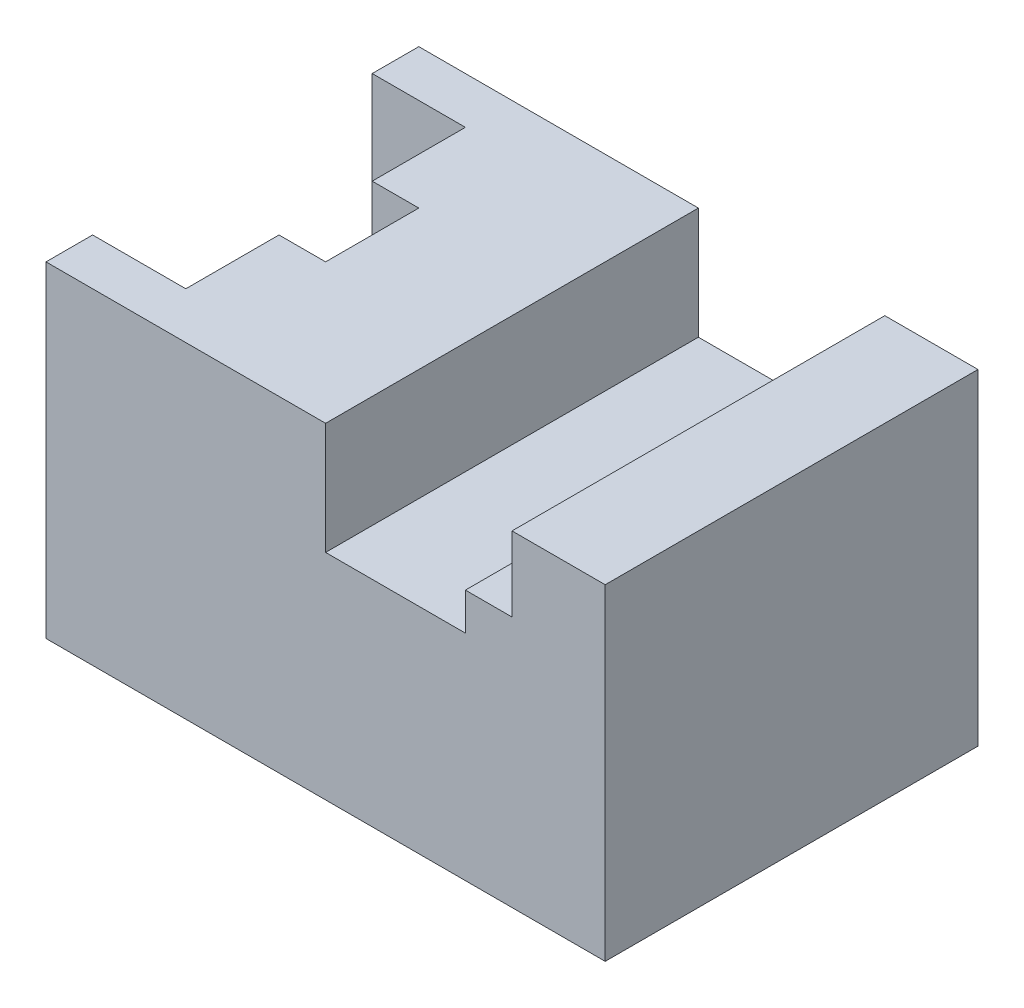
ISO-10303-21;
HEADER;
FILE_DESCRIPTION(('STEP AP214'),'2;1');
FILE_NAME('part.step','',(''),(''),'','','');
FILE_SCHEMA(('AUTOMOTIVE_DESIGN { 1 0 10303 214 1 1 1 1 }'));
ENDSEC;
DATA;
#1=APPLICATION_CONTEXT('core data for automotive mechanical design processes');
#2=APPLICATION_PROTOCOL_DEFINITION('international standard','automotive_design',2000,#1);
#3=PRODUCT_CONTEXT('',#1,'mechanical');
#4=PRODUCT('Part','Part','',(#3));
#5=PRODUCT_RELATED_PRODUCT_CATEGORY('part','',(#4));
#6=PRODUCT_DEFINITION_FORMATION('','',#4);
#7=PRODUCT_DEFINITION_CONTEXT('part definition',#1,'design');
#8=PRODUCT_DEFINITION('design','',#6,#7);
#9=PRODUCT_DEFINITION_SHAPE('','',#8);
#10=(LENGTH_UNIT() NAMED_UNIT(*) SI_UNIT(.MILLI.,.METRE.));
#11=(NAMED_UNIT(*) PLANE_ANGLE_UNIT() SI_UNIT($,.RADIAN.));
#12=(NAMED_UNIT(*) SI_UNIT($,.STERADIAN.) SOLID_ANGLE_UNIT());
#13=UNCERTAINTY_MEASURE_WITH_UNIT(LENGTH_MEASURE(1.E-05),#10,'distance_accuracy_value','');
#14=(GEOMETRIC_REPRESENTATION_CONTEXT(3) GLOBAL_UNCERTAINTY_ASSIGNED_CONTEXT((#13)) GLOBAL_UNIT_ASSIGNED_CONTEXT((#10,
#11,#12)) REPRESENTATION_CONTEXT('',''));
#15=CARTESIAN_POINT('',(0.,0.,0.));
#16=DIRECTION('',(0.,0.,1.));
#17=DIRECTION('',(1.,0.,0.));
#18=AXIS2_PLACEMENT_3D('',#15,#16,#17);
#19=CARTESIAN_POINT('',(-30.,17.5,20.));
#20=DIRECTION('',(0.,-1.,0.));
#21=DIRECTION('',(0.,0.,-1.));
#22=AXIS2_PLACEMENT_3D('',#19,#20,#21);
#23=PLANE('',#22);
#24=DIRECTION('',(0.,0.,1.));
#25=VECTOR('',#24,1.);
#26=CARTESIAN_POINT('',(0.,17.5,-20.));
#27=LINE('',#26,#25);
#28=CARTESIAN_POINT('',(0.,17.5,-20.));
#29=VERTEX_POINT('',#28);
#30=CARTESIAN_POINT('',(0.,17.5,20.));
#31=VERTEX_POINT('',#30);
#32=EDGE_CURVE('E203',#29,#31,#27,.T.);
#33=ORIENTED_EDGE('',*,*,#32,.F.);
#34=DIRECTION('',(-1.,0.,0.));
#35=VECTOR('',#34,1.);
#36=CARTESIAN_POINT('',(-30.,17.5,-20.));
#37=LINE('',#36,#35);
#38=CARTESIAN_POINT('',(-30.,17.5,-20.));
#39=VERTEX_POINT('',#38);
#40=EDGE_CURVE('E278',#29,#39,#37,.T.);
#41=ORIENTED_EDGE('',*,*,#40,.T.);
#42=DIRECTION('',(0.,0.,-1.));
#43=VECTOR('',#42,1.);
#44=CARTESIAN_POINT('',(-30.,17.5,20.));
#45=LINE('',#44,#43);
#46=CARTESIAN_POINT('',(-30.,17.5,-15.));
#47=VERTEX_POINT('',#46);
#48=EDGE_CURVE('E289',#47,#39,#45,.T.);
#49=ORIENTED_EDGE('',*,*,#48,.F.);
#50=DIRECTION('',(1.,0.,0.));
#51=VECTOR('',#50,1.);
#52=CARTESIAN_POINT('',(0.,17.5,-15.));
#53=LINE('',#52,#51);
#54=CARTESIAN_POINT('',(-20.,17.5,-15.));
#55=VERTEX_POINT('',#54);
#56=EDGE_CURVE('E244',#47,#55,#53,.T.);
#57=ORIENTED_EDGE('',*,*,#56,.T.);
#58=DIRECTION('',(0.,0.,-1.));
#59=VECTOR('',#58,1.);
#60=CARTESIAN_POINT('',(-20.,17.5,0.));
#61=LINE('',#60,#59);
#62=CARTESIAN_POINT('',(-20.,17.5,-5.));
#63=VERTEX_POINT('',#62);
#64=EDGE_CURVE('E235',#63,#55,#61,.T.);
#65=ORIENTED_EDGE('',*,*,#64,.F.);
#66=DIRECTION('',(-1.,0.,0.));
#67=VECTOR('',#66,1.);
#68=CARTESIAN_POINT('',(0.,17.5,-5.));
#69=LINE('',#68,#67);
#70=CARTESIAN_POINT('',(-15.,17.5,-5.));
#71=VERTEX_POINT('',#70);
#72=EDGE_CURVE('E241',#71,#63,#69,.T.);
#73=ORIENTED_EDGE('',*,*,#72,.F.);
#74=DIRECTION('',(0.,0.,-1.));
#75=VECTOR('',#74,1.);
#76=CARTESIAN_POINT('',(-15.,17.5,0.));
#77=LINE('',#76,#75);
#78=CARTESIAN_POINT('',(-15.,17.5,5.));
#79=VERTEX_POINT('',#78);
#80=EDGE_CURVE('E238',#79,#71,#77,.T.);
#81=ORIENTED_EDGE('',*,*,#80,.F.);
#82=DIRECTION('',(-1.,0.,0.));
#83=VECTOR('',#82,1.);
#84=CARTESIAN_POINT('',(0.,17.5,5.));
#85=LINE('',#84,#83);
#86=CARTESIAN_POINT('',(-20.,17.5,5.));
#87=VERTEX_POINT('',#86);
#88=EDGE_CURVE('E234',#79,#87,#85,.T.);
#89=ORIENTED_EDGE('',*,*,#88,.T.);
#90=CARTESIAN_POINT('',(-20.,17.5,15.));
#91=VERTEX_POINT('',#90);
#92=EDGE_CURVE('E231',#91,#87,#61,.T.);
#93=ORIENTED_EDGE('',*,*,#92,.F.);
#94=DIRECTION('',(1.,0.,0.));
#95=VECTOR('',#94,1.);
#96=CARTESIAN_POINT('',(0.,17.5,15.));
#97=LINE('',#96,#95);
#98=CARTESIAN_POINT('',(-30.,17.5,15.));
#99=VERTEX_POINT('',#98);
#100=EDGE_CURVE('E202',#99,#91,#97,.T.);
#101=ORIENTED_EDGE('',*,*,#100,.F.);
#102=CARTESIAN_POINT('',(-30.,17.5,20.));
#103=VERTEX_POINT('',#102);
#104=EDGE_CURVE('E44',#103,#99,#45,.T.);
#105=ORIENTED_EDGE('',*,*,#104,.F.);
#106=DIRECTION('',(-1.,0.,0.));
#107=VECTOR('',#106,1.);
#108=CARTESIAN_POINT('',(-30.,17.5,20.));
#109=LINE('',#108,#107);
#110=EDGE_CURVE('E266',#31,#103,#109,.T.);
#111=ORIENTED_EDGE('',*,*,#110,.F.);
#112=EDGE_LOOP('',(#33,#41,#49,#57,#65,#73,#81,#89,#93,#101,#105,#111));
#113=FACE_BOUND('',#112,.T.);
#114=ADVANCED_FACE('F36',(#113),#23,.F.);
#115=CARTESIAN_POINT('',(0.,0.,20.));
#116=DIRECTION('',(0.,0.,-1.));
#117=DIRECTION('',(-1.,0.,0.));
#118=AXIS2_PLACEMENT_3D('',#115,#116,#117);
#119=PLANE('',#118);
#120=DIRECTION('',(0.,1.,0.));
#121=VECTOR('',#120,1.);
#122=CARTESIAN_POINT('',(0.,0.,20.));
#123=LINE('',#122,#121);
#124=CARTESIAN_POINT('',(0.,5.5,20.));
#125=VERTEX_POINT('',#124);
#126=EDGE_CURVE('E182',#125,#31,#123,.T.);
#127=ORIENTED_EDGE('',*,*,#126,.T.);
#128=ORIENTED_EDGE('',*,*,#110,.T.);
#129=DIRECTION('',(0.,-1.,0.));
#130=VECTOR('',#129,1.);
#131=CARTESIAN_POINT('',(-30.,-17.5,20.));
#132=LINE('',#131,#130);
#133=CARTESIAN_POINT('',(-30.,-17.5,20.));
#134=VERTEX_POINT('',#133);
#135=EDGE_CURVE('E271',#103,#134,#132,.T.);
#136=ORIENTED_EDGE('',*,*,#135,.T.);
#137=DIRECTION('',(1.,0.,0.));
#138=VECTOR('',#137,1.);
#139=CARTESIAN_POINT('',(-30.,-17.5,20.));
#140=LINE('',#139,#138);
#141=CARTESIAN_POINT('',(30.,-17.5,20.));
#142=VERTEX_POINT('',#141);
#143=EDGE_CURVE('E273',#134,#142,#140,.T.);
#144=ORIENTED_EDGE('',*,*,#143,.T.);
#145=DIRECTION('',(0.,1.,0.));
#146=VECTOR('',#145,1.);
#147=CARTESIAN_POINT('',(30.,-17.5,20.));
#148=LINE('',#147,#146);
#149=CARTESIAN_POINT('',(30.,17.5,20.));
#150=VERTEX_POINT('',#149);
#151=EDGE_CURVE('E263',#142,#150,#148,.T.);
#152=ORIENTED_EDGE('',*,*,#151,.T.);
#153=CARTESIAN_POINT('',(20.,17.5,20.));
#154=VERTEX_POINT('',#153);
#155=EDGE_CURVE('E268',#150,#154,#109,.T.);
#156=ORIENTED_EDGE('',*,*,#155,.T.);
#157=DIRECTION('',(0.,1.,0.));
#158=VECTOR('',#157,1.);
#159=CARTESIAN_POINT('',(20.,0.,20.));
#160=LINE('',#159,#158);
#161=CARTESIAN_POINT('',(20.,9.5,20.));
#162=VERTEX_POINT('',#161);
#163=EDGE_CURVE('E185',#162,#154,#160,.T.);
#164=ORIENTED_EDGE('',*,*,#163,.F.);
#165=DIRECTION('',(1.,0.,0.));
#166=VECTOR('',#165,1.);
#167=CARTESIAN_POINT('',(0.,9.5,20.));
#168=LINE('',#167,#166);
#169=CARTESIAN_POINT('',(15.,9.5,20.));
#170=VERTEX_POINT('',#169);
#171=EDGE_CURVE('E196',#170,#162,#168,.T.);
#172=ORIENTED_EDGE('',*,*,#171,.F.);
#173=DIRECTION('',(0.,1.,0.));
#174=VECTOR('',#173,1.);
#175=CARTESIAN_POINT('',(15.,0.,20.));
#176=LINE('',#175,#174);
#177=CARTESIAN_POINT('',(15.,5.5,20.));
#178=VERTEX_POINT('',#177);
#179=EDGE_CURVE('E194',#178,#170,#176,.T.);
#180=ORIENTED_EDGE('',*,*,#179,.F.);
#181=DIRECTION('',(1.,0.,0.));
#182=VECTOR('',#181,1.);
#183=CARTESIAN_POINT('',(0.,5.5,20.));
#184=LINE('',#183,#182);
#185=EDGE_CURVE('E168',#125,#178,#184,.T.);
#186=ORIENTED_EDGE('',*,*,#185,.F.);
#187=EDGE_LOOP('',(#127,#128,#136,#144,#152,#156,#164,#172,#180,#186));
#188=FACE_BOUND('',#187,.T.);
#189=ADVANCED_FACE('F311',(#188),#119,.F.);
#190=CARTESIAN_POINT('',(0.,0.,-20.));
#191=DIRECTION('',(0.,0.,-1.));
#192=DIRECTION('',(-1.,0.,0.));
#193=AXIS2_PLACEMENT_3D('',#190,#191,#192);
#194=PLANE('',#193);
#195=ORIENTED_EDGE('',*,*,#40,.F.);
#196=DIRECTION('',(0.,1.,0.));
#197=VECTOR('',#196,1.);
#198=CARTESIAN_POINT('',(0.,0.,-20.));
#199=LINE('',#198,#197);
#200=CARTESIAN_POINT('',(0.,5.5,-20.));
#201=VERTEX_POINT('',#200);
#202=EDGE_CURVE('E173',#201,#29,#199,.T.);
#203=ORIENTED_EDGE('',*,*,#202,.F.);
#204=DIRECTION('',(1.,0.,0.));
#205=VECTOR('',#204,1.);
#206=CARTESIAN_POINT('',(0.,5.5,-20.));
#207=LINE('',#206,#205);
#208=CARTESIAN_POINT('',(15.,5.5,-20.));
#209=VERTEX_POINT('',#208);
#210=EDGE_CURVE('E165',#201,#209,#207,.T.);
#211=ORIENTED_EDGE('',*,*,#210,.T.);
#212=DIRECTION('',(0.,1.,0.));
#213=VECTOR('',#212,1.);
#214=CARTESIAN_POINT('',(15.,0.,-20.));
#215=LINE('',#214,#213);
#216=CARTESIAN_POINT('',(15.,9.5,-20.));
#217=VERTEX_POINT('',#216);
#218=EDGE_CURVE('E176',#209,#217,#215,.T.);
#219=ORIENTED_EDGE('',*,*,#218,.T.);
#220=DIRECTION('',(1.,0.,0.));
#221=VECTOR('',#220,1.);
#222=CARTESIAN_POINT('',(0.,9.5,-20.));
#223=LINE('',#222,#221);
#224=CARTESIAN_POINT('',(20.,9.5,-20.));
#225=VERTEX_POINT('',#224);
#226=EDGE_CURVE('E51',#217,#225,#223,.T.);
#227=ORIENTED_EDGE('',*,*,#226,.T.);
#228=DIRECTION('',(0.,1.,0.));
#229=VECTOR('',#228,1.);
#230=CARTESIAN_POINT('',(20.,0.,-20.));
#231=LINE('',#230,#229);
#232=CARTESIAN_POINT('',(20.,17.5,-20.));
#233=VERTEX_POINT('',#232);
#234=EDGE_CURVE('E189',#225,#233,#231,.T.);
#235=ORIENTED_EDGE('',*,*,#234,.T.);
#236=CARTESIAN_POINT('',(30.,17.5,-20.));
#237=VERTEX_POINT('',#236);
#238=EDGE_CURVE('E279',#237,#233,#37,.T.);
#239=ORIENTED_EDGE('',*,*,#238,.F.);
#240=DIRECTION('',(0.,1.,0.));
#241=VECTOR('',#240,1.);
#242=CARTESIAN_POINT('',(30.,-17.5,-20.));
#243=LINE('',#242,#241);
#244=CARTESIAN_POINT('',(30.,-17.5,-20.));
#245=VERTEX_POINT('',#244);
#246=EDGE_CURVE('E262',#245,#237,#243,.T.);
#247=ORIENTED_EDGE('',*,*,#246,.F.);
#248=DIRECTION('',(1.,0.,0.));
#249=VECTOR('',#248,1.);
#250=CARTESIAN_POINT('',(-30.,-17.5,-20.));
#251=LINE('',#250,#249);
#252=CARTESIAN_POINT('',(-30.,-17.5,-20.));
#253=VERTEX_POINT('',#252);
#254=EDGE_CURVE('E267',#253,#245,#251,.T.);
#255=ORIENTED_EDGE('',*,*,#254,.F.);
#256=DIRECTION('',(0.,-1.,0.));
#257=VECTOR('',#256,1.);
#258=CARTESIAN_POINT('',(-30.,-17.5,-20.));
#259=LINE('',#258,#257);
#260=EDGE_CURVE('E282',#39,#253,#259,.T.);
#261=ORIENTED_EDGE('',*,*,#260,.F.);
#262=EDGE_LOOP('',(#195,#203,#211,#219,#227,#235,#239,#247,#255,#261));
#263=FACE_BOUND('',#262,.T.);
#264=ADVANCED_FACE('F181',(#263),#194,.T.);
#265=CARTESIAN_POINT('',(30.,-17.5,20.));
#266=DIRECTION('',(-1.,0.,0.));
#267=DIRECTION('',(0.,0.,1.));
#268=AXIS2_PLACEMENT_3D('',#265,#266,#267);
#269=PLANE('',#268);
#270=ORIENTED_EDGE('',*,*,#246,.T.);
#271=DIRECTION('',(0.,0.,-1.));
#272=VECTOR('',#271,1.);
#273=CARTESIAN_POINT('',(30.,17.5,20.));
#274=LINE('',#273,#272);
#275=EDGE_CURVE('E12',#150,#237,#274,.T.);
#276=ORIENTED_EDGE('',*,*,#275,.F.);
#277=ORIENTED_EDGE('',*,*,#151,.F.);
#278=DIRECTION('',(0.,0.,-1.));
#279=VECTOR('',#278,1.);
#280=CARTESIAN_POINT('',(30.,-17.5,20.));
#281=LINE('',#280,#279);
#282=EDGE_CURVE('E275',#142,#245,#281,.T.);
#283=ORIENTED_EDGE('',*,*,#282,.T.);
#284=EDGE_LOOP('',(#270,#276,#277,#283));
#285=FACE_BOUND('',#284,.T.);
#286=ADVANCED_FACE('F38',(#285),#269,.F.);
#287=ORIENTED_EDGE('',*,*,#238,.T.);
#288=DIRECTION('',(0.,0.,1.));
#289=VECTOR('',#288,1.);
#290=CARTESIAN_POINT('',(20.,17.5,-20.));
#291=LINE('',#290,#289);
#292=EDGE_CURVE('E205',#233,#154,#291,.T.);
#293=ORIENTED_EDGE('',*,*,#292,.T.);
#294=ORIENTED_EDGE('',*,*,#155,.F.);
#295=ORIENTED_EDGE('',*,*,#275,.T.);
#296=EDGE_LOOP('',(#287,#293,#294,#295));
#297=FACE_BOUND('',#296,.T.);
#298=ADVANCED_FACE('F362',(#297),#23,.F.);
#299=CARTESIAN_POINT('',(-30.,-17.5,20.));
#300=DIRECTION('',(1.,0.,0.));
#301=DIRECTION('',(0.,0.,-1.));
#302=AXIS2_PLACEMENT_3D('',#299,#300,#301);
#303=PLANE('',#302);
#304=ORIENTED_EDGE('',*,*,#104,.T.);
#305=DIRECTION('',(0.,1.,0.));
#306=VECTOR('',#305,1.);
#307=CARTESIAN_POINT('',(-30.,-51.0410196624968,15.));
#308=LINE('',#307,#306);
#309=CARTESIAN_POINT('',(-30.,-7.50000000000001,15.));
#310=VERTEX_POINT('',#309);
#311=EDGE_CURVE('E215',#310,#99,#308,.T.);
#312=ORIENTED_EDGE('',*,*,#311,.F.);
#313=DIRECTION('',(0.,0.,-1.));
#314=VECTOR('',#313,1.);
#315=CARTESIAN_POINT('',(-30.,-7.50000000000001,0.));
#316=LINE('',#315,#314);
#317=CARTESIAN_POINT('',(-30.,-7.50000000000001,-15.));
#318=VERTEX_POINT('',#317);
#319=EDGE_CURVE('E223',#310,#318,#316,.T.);
#320=ORIENTED_EDGE('',*,*,#319,.T.);
#321=DIRECTION('',(0.,1.,0.));
#322=VECTOR('',#321,1.);
#323=CARTESIAN_POINT('',(-30.,-51.0410196624968,-15.));
#324=LINE('',#323,#322);
#325=EDGE_CURVE('E59',#318,#47,#324,.T.);
#326=ORIENTED_EDGE('',*,*,#325,.T.);
#327=ORIENTED_EDGE('',*,*,#48,.T.);
#328=ORIENTED_EDGE('',*,*,#260,.T.);
#329=DIRECTION('',(0.,0.,-1.));
#330=VECTOR('',#329,1.);
#331=CARTESIAN_POINT('',(-30.,-17.5,20.));
#332=LINE('',#331,#330);
#333=EDGE_CURVE('E287',#134,#253,#332,.T.);
#334=ORIENTED_EDGE('',*,*,#333,.F.);
#335=ORIENTED_EDGE('',*,*,#135,.F.);
#336=EDGE_LOOP('',(#304,#312,#320,#326,#327,#328,#334,#335));
#337=FACE_BOUND('',#336,.T.);
#338=ADVANCED_FACE('F298',(#337),#303,.F.);
#339=CARTESIAN_POINT('',(-30.,-17.5,20.));
#340=DIRECTION('',(0.,1.,0.));
#341=DIRECTION('',(0.,0.,1.));
#342=AXIS2_PLACEMENT_3D('',#339,#340,#341);
#343=PLANE('',#342);
#344=ORIENTED_EDGE('',*,*,#254,.T.);
#345=ORIENTED_EDGE('',*,*,#282,.F.);
#346=ORIENTED_EDGE('',*,*,#143,.F.);
#347=ORIENTED_EDGE('',*,*,#333,.T.);
#348=EDGE_LOOP('',(#344,#345,#346,#347));
#349=FACE_BOUND('',#348,.T.);
#350=ADVANCED_FACE('F305',(#349),#343,.F.);
#351=CARTESIAN_POINT('',(0.,-51.0410196624968,15.));
#352=DIRECTION('',(0.,0.,1.));
#353=DIRECTION('',(1.,0.,0.));
#354=AXIS2_PLACEMENT_3D('',#351,#352,#353);
#355=PLANE('',#354);
#356=DIRECTION('',(-1.,0.,0.));
#357=VECTOR('',#356,1.);
#358=CARTESIAN_POINT('',(0.,-7.50000000000001,15.));
#359=LINE('',#358,#357);
#360=CARTESIAN_POINT('',(-20.,-7.50000000000001,15.));
#361=VERTEX_POINT('',#360);
#362=EDGE_CURVE('E226',#361,#310,#359,.T.);
#363=ORIENTED_EDGE('',*,*,#362,.T.);
#364=ORIENTED_EDGE('',*,*,#311,.T.);
#365=ORIENTED_EDGE('',*,*,#100,.T.);
#366=DIRECTION('',(0.,1.,0.));
#367=VECTOR('',#366,1.);
#368=CARTESIAN_POINT('',(-20.,-51.0410196624968,15.));
#369=LINE('',#368,#367);
#370=EDGE_CURVE('E247',#361,#91,#369,.T.);
#371=ORIENTED_EDGE('',*,*,#370,.F.);
#372=EDGE_LOOP('',(#363,#364,#365,#371));
#373=FACE_BOUND('',#372,.T.);
#374=ADVANCED_FACE('F320',(#373),#355,.F.);
#375=CARTESIAN_POINT('',(0.,-51.0410196624968,-15.));
#376=DIRECTION('',(0.,0.,1.));
#377=DIRECTION('',(1.,0.,0.));
#378=AXIS2_PLACEMENT_3D('',#375,#376,#377);
#379=PLANE('',#378);
#380=DIRECTION('',(0.,1.,0.));
#381=VECTOR('',#380,1.);
#382=CARTESIAN_POINT('',(-20.,-51.0410196624968,-15.));
#383=LINE('',#382,#381);
#384=CARTESIAN_POINT('',(-20.,-7.50000000000001,-15.));
#385=VERTEX_POINT('',#384);
#386=EDGE_CURVE('E250',#385,#55,#383,.T.);
#387=ORIENTED_EDGE('',*,*,#386,.T.);
#388=ORIENTED_EDGE('',*,*,#56,.F.);
#389=ORIENTED_EDGE('',*,*,#325,.F.);
#390=DIRECTION('',(-1.,0.,0.));
#391=VECTOR('',#390,1.);
#392=CARTESIAN_POINT('',(0.,-7.50000000000001,-15.));
#393=LINE('',#392,#391);
#394=EDGE_CURVE('E221',#385,#318,#393,.T.);
#395=ORIENTED_EDGE('',*,*,#394,.F.);
#396=EDGE_LOOP('',(#387,#388,#389,#395));
#397=FACE_BOUND('',#396,.T.);
#398=ADVANCED_FACE('F329',(#397),#379,.T.);
#399=CARTESIAN_POINT('',(-20.,-51.0410196624968,0.));
#400=DIRECTION('',(1.,0.,0.));
#401=DIRECTION('',(0.,0.,-1.));
#402=AXIS2_PLACEMENT_3D('',#399,#400,#401);
#403=PLANE('',#402);
#404=DIRECTION('',(0.,0.,1.));
#405=VECTOR('',#404,1.);
#406=CARTESIAN_POINT('',(-20.,-7.50000000000001,0.));
#407=LINE('',#406,#405);
#408=CARTESIAN_POINT('',(-20.,-7.50000000000001,-5.));
#409=VERTEX_POINT('',#408);
#410=EDGE_CURVE('E219',#385,#409,#407,.T.);
#411=ORIENTED_EDGE('',*,*,#410,.T.);
#412=DIRECTION('',(0.,1.,0.));
#413=VECTOR('',#412,1.);
#414=CARTESIAN_POINT('',(-20.,-51.0410196624968,-5.));
#415=LINE('',#414,#413);
#416=EDGE_CURVE('E252',#409,#63,#415,.T.);
#417=ORIENTED_EDGE('',*,*,#416,.T.);
#418=ORIENTED_EDGE('',*,*,#64,.T.);
#419=ORIENTED_EDGE('',*,*,#386,.F.);
#420=EDGE_LOOP('',(#411,#417,#418,#419));
#421=FACE_BOUND('',#420,.T.);
#422=ADVANCED_FACE('F333',(#421),#403,.F.);
#423=CARTESIAN_POINT('',(0.,-51.0410196624968,-5.));
#424=DIRECTION('',(0.,0.,-1.));
#425=DIRECTION('',(-1.,0.,0.));
#426=AXIS2_PLACEMENT_3D('',#423,#424,#425);
#427=PLANE('',#426);
#428=DIRECTION('',(1.,0.,0.));
#429=VECTOR('',#428,1.);
#430=CARTESIAN_POINT('',(0.,-7.50000000000001,-5.));
#431=LINE('',#430,#429);
#432=CARTESIAN_POINT('',(-15.,-7.50000000000001,-5.));
#433=VERTEX_POINT('',#432);
#434=EDGE_CURVE('E217',#409,#433,#431,.T.);
#435=ORIENTED_EDGE('',*,*,#434,.T.);
#436=DIRECTION('',(0.,1.,0.));
#437=VECTOR('',#436,1.);
#438=CARTESIAN_POINT('',(-15.,-51.0410196624968,-5.));
#439=LINE('',#438,#437);
#440=EDGE_CURVE('E254',#433,#71,#439,.T.);
#441=ORIENTED_EDGE('',*,*,#440,.T.);
#442=ORIENTED_EDGE('',*,*,#72,.T.);
#443=ORIENTED_EDGE('',*,*,#416,.F.);
#444=EDGE_LOOP('',(#435,#441,#442,#443));
#445=FACE_BOUND('',#444,.T.);
#446=ADVANCED_FACE('F338',(#445),#427,.F.);
#447=CARTESIAN_POINT('',(-15.,-51.0410196624968,0.));
#448=DIRECTION('',(1.,0.,0.));
#449=DIRECTION('',(0.,0.,-1.));
#450=AXIS2_PLACEMENT_3D('',#447,#448,#449);
#451=PLANE('',#450);
#452=DIRECTION('',(0.,0.,1.));
#453=VECTOR('',#452,1.);
#454=CARTESIAN_POINT('',(-15.,-7.50000000000001,0.));
#455=LINE('',#454,#453);
#456=CARTESIAN_POINT('',(-15.,-7.50000000000001,5.));
#457=VERTEX_POINT('',#456);
#458=EDGE_CURVE('E214',#433,#457,#455,.T.);
#459=ORIENTED_EDGE('',*,*,#458,.T.);
#460=DIRECTION('',(0.,1.,0.));
#461=VECTOR('',#460,1.);
#462=CARTESIAN_POINT('',(-15.,-51.0410196624968,5.));
#463=LINE('',#462,#461);
#464=EDGE_CURVE('E256',#457,#79,#463,.T.);
#465=ORIENTED_EDGE('',*,*,#464,.T.);
#466=ORIENTED_EDGE('',*,*,#80,.T.);
#467=ORIENTED_EDGE('',*,*,#440,.F.);
#468=EDGE_LOOP('',(#459,#465,#466,#467));
#469=FACE_BOUND('',#468,.T.);
#470=ADVANCED_FACE('F342',(#469),#451,.F.);
#471=CARTESIAN_POINT('',(0.,-51.0410196624968,5.));
#472=DIRECTION('',(0.,0.,-1.));
#473=DIRECTION('',(-1.,0.,0.));
#474=AXIS2_PLACEMENT_3D('',#471,#472,#473);
#475=PLANE('',#474);
#476=DIRECTION('',(0.,1.,0.));
#477=VECTOR('',#476,1.);
#478=CARTESIAN_POINT('',(-20.,-51.0410196624968,5.));
#479=LINE('',#478,#477);
#480=CARTESIAN_POINT('',(-20.,-7.50000000000001,5.));
#481=VERTEX_POINT('',#480);
#482=EDGE_CURVE('E258',#481,#87,#479,.T.);
#483=ORIENTED_EDGE('',*,*,#482,.T.);
#484=ORIENTED_EDGE('',*,*,#88,.F.);
#485=ORIENTED_EDGE('',*,*,#464,.F.);
#486=DIRECTION('',(1.,0.,0.));
#487=VECTOR('',#486,1.);
#488=CARTESIAN_POINT('',(0.,-7.50000000000001,5.));
#489=LINE('',#488,#487);
#490=EDGE_CURVE('E211',#481,#457,#489,.T.);
#491=ORIENTED_EDGE('',*,*,#490,.F.);
#492=EDGE_LOOP('',(#483,#484,#485,#491));
#493=FACE_BOUND('',#492,.T.);
#494=ADVANCED_FACE('F346',(#493),#475,.T.);
#495=DIRECTION('',(0.,0.,1.));
#496=VECTOR('',#495,1.);
#497=CARTESIAN_POINT('',(-20.,-7.50000000000001,0.));
#498=LINE('',#497,#496);
#499=EDGE_CURVE('E228',#481,#361,#498,.T.);
#500=ORIENTED_EDGE('',*,*,#499,.T.);
#501=ORIENTED_EDGE('',*,*,#370,.T.);
#502=ORIENTED_EDGE('',*,*,#92,.T.);
#503=ORIENTED_EDGE('',*,*,#482,.F.);
#504=EDGE_LOOP('',(#500,#501,#502,#503));
#505=FACE_BOUND('',#504,.T.);
#506=ADVANCED_FACE('F349',(#505),#403,.F.);
#507=CARTESIAN_POINT('',(-30.,-7.50000000000001,20.));
#508=DIRECTION('',(0.,1.,0.));
#509=DIRECTION('',(0.,0.,1.));
#510=AXIS2_PLACEMENT_3D('',#507,#508,#509);
#511=PLANE('',#510);
#512=ORIENTED_EDGE('',*,*,#362,.F.);
#513=ORIENTED_EDGE('',*,*,#499,.F.);
#514=ORIENTED_EDGE('',*,*,#490,.T.);
#515=ORIENTED_EDGE('',*,*,#458,.F.);
#516=ORIENTED_EDGE('',*,*,#434,.F.);
#517=ORIENTED_EDGE('',*,*,#410,.F.);
#518=ORIENTED_EDGE('',*,*,#394,.T.);
#519=ORIENTED_EDGE('',*,*,#319,.F.);
#520=EDGE_LOOP('',(#512,#513,#514,#515,#516,#517,#518,#519));
#521=FACE_BOUND('',#520,.T.);
#522=ADVANCED_FACE('F324',(#521),#511,.T.);
#523=CARTESIAN_POINT('',(0.,5.5,-20.));
#524=DIRECTION('',(0.,-1.,0.));
#525=DIRECTION('',(0.,0.,-1.));
#526=AXIS2_PLACEMENT_3D('',#523,#524,#525);
#527=PLANE('',#526);
#528=ORIENTED_EDGE('',*,*,#185,.T.);
#529=DIRECTION('',(0.,0.,1.));
#530=VECTOR('',#529,1.);
#531=CARTESIAN_POINT('',(15.,5.5,-20.));
#532=LINE('',#531,#530);
#533=EDGE_CURVE('E161',#209,#178,#532,.T.);
#534=ORIENTED_EDGE('',*,*,#533,.F.);
#535=ORIENTED_EDGE('',*,*,#210,.F.);
#536=DIRECTION('',(0.,0.,1.));
#537=VECTOR('',#536,1.);
#538=CARTESIAN_POINT('',(0.,5.5,-20.));
#539=LINE('',#538,#537);
#540=EDGE_CURVE('E200',#201,#125,#539,.T.);
#541=ORIENTED_EDGE('',*,*,#540,.T.);
#542=EDGE_LOOP('',(#528,#534,#535,#541));
#543=FACE_BOUND('',#542,.T.);
#544=ADVANCED_FACE('F163',(#543),#527,.F.);
#545=CARTESIAN_POINT('',(0.,0.,-20.));
#546=DIRECTION('',(1.,0.,0.));
#547=DIRECTION('',(0.,0.,-1.));
#548=AXIS2_PLACEMENT_3D('',#545,#546,#547);
#549=PLANE('',#548);
#550=ORIENTED_EDGE('',*,*,#126,.F.);
#551=ORIENTED_EDGE('',*,*,#540,.F.);
#552=ORIENTED_EDGE('',*,*,#202,.T.);
#553=ORIENTED_EDGE('',*,*,#32,.T.);
#554=EDGE_LOOP('',(#550,#551,#552,#553));
#555=FACE_BOUND('',#554,.T.);
#556=ADVANCED_FACE('F386',(#555),#549,.T.);
#557=CARTESIAN_POINT('',(20.,0.,-20.));
#558=DIRECTION('',(1.,0.,0.));
#559=DIRECTION('',(0.,0.,-1.));
#560=AXIS2_PLACEMENT_3D('',#557,#558,#559);
#561=PLANE('',#560);
#562=ORIENTED_EDGE('',*,*,#163,.T.);
#563=ORIENTED_EDGE('',*,*,#292,.F.);
#564=ORIENTED_EDGE('',*,*,#234,.F.);
#565=DIRECTION('',(0.,0.,1.));
#566=VECTOR('',#565,1.);
#567=CARTESIAN_POINT('',(20.,9.5,-20.));
#568=LINE('',#567,#566);
#569=EDGE_CURVE('E208',#225,#162,#568,.T.);
#570=ORIENTED_EDGE('',*,*,#569,.T.);
#571=EDGE_LOOP('',(#562,#563,#564,#570));
#572=FACE_BOUND('',#571,.T.);
#573=ADVANCED_FACE('F376',(#572),#561,.F.);
#574=CARTESIAN_POINT('',(0.,9.5,-20.));
#575=DIRECTION('',(0.,-1.,0.));
#576=DIRECTION('',(0.,0.,-1.));
#577=AXIS2_PLACEMENT_3D('',#574,#575,#576);
#578=PLANE('',#577);
#579=ORIENTED_EDGE('',*,*,#171,.T.);
#580=ORIENTED_EDGE('',*,*,#569,.F.);
#581=ORIENTED_EDGE('',*,*,#226,.F.);
#582=DIRECTION('',(0.,0.,1.));
#583=VECTOR('',#582,1.);
#584=CARTESIAN_POINT('',(15.,9.5,-20.));
#585=LINE('',#584,#583);
#586=EDGE_CURVE('E172',#217,#170,#585,.T.);
#587=ORIENTED_EDGE('',*,*,#586,.T.);
#588=EDGE_LOOP('',(#579,#580,#581,#587));
#589=FACE_BOUND('',#588,.T.);
#590=ADVANCED_FACE('F378',(#589),#578,.F.);
#591=CARTESIAN_POINT('',(15.,0.,-20.));
#592=DIRECTION('',(1.,0.,0.));
#593=DIRECTION('',(0.,0.,-1.));
#594=AXIS2_PLACEMENT_3D('',#591,#592,#593);
#595=PLANE('',#594);
#596=ORIENTED_EDGE('',*,*,#179,.T.);
#597=ORIENTED_EDGE('',*,*,#586,.F.);
#598=ORIENTED_EDGE('',*,*,#218,.F.);
#599=ORIENTED_EDGE('',*,*,#533,.T.);
#600=EDGE_LOOP('',(#596,#597,#598,#599));
#601=FACE_BOUND('',#600,.T.);
#602=ADVANCED_FACE('F177',(#601),#595,.F.);
#603=CLOSED_SHELL('',(#114,#189,#264,#286,#298,#338,#350,#374,#398,#422,#446,#470,#494,#506,
#522,#544,#556,#573,#590,#602));
#604=MANIFOLD_SOLID_BREP('B2',#603);
#605=ADVANCED_BREP_SHAPE_REPRESENTATION('',(#18,#604),#14);
#606=SHAPE_DEFINITION_REPRESENTATION(#9,#605);
ENDSEC;
END-ISO-10303-21;
